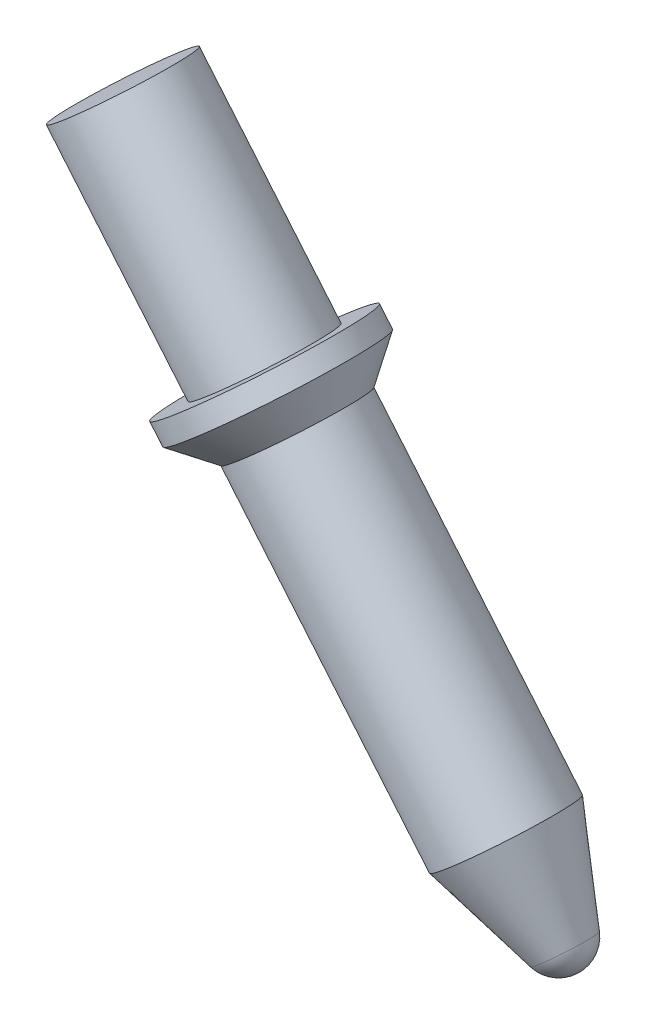
ISO-10303-21;
HEADER;
FILE_DESCRIPTION(('STEP AP214'),'2;1');
FILE_NAME('part.step','',(''),(''),'','','');
FILE_SCHEMA(('AUTOMOTIVE_DESIGN { 1 0 10303 214 1 1 1 1 }'));
ENDSEC;
DATA;
#1=APPLICATION_CONTEXT('core data for automotive mechanical design processes');
#2=APPLICATION_PROTOCOL_DEFINITION('international standard','automotive_design',2000,#1);
#3=PRODUCT_CONTEXT('',#1,'mechanical');
#4=PRODUCT('Part','Part','',(#3));
#5=PRODUCT_RELATED_PRODUCT_CATEGORY('part','',(#4));
#6=PRODUCT_DEFINITION_FORMATION('','',#4);
#7=PRODUCT_DEFINITION_CONTEXT('part definition',#1,'design');
#8=PRODUCT_DEFINITION('design','',#6,#7);
#9=PRODUCT_DEFINITION_SHAPE('','',#8);
#10=(LENGTH_UNIT() NAMED_UNIT(*) SI_UNIT(.MILLI.,.METRE.));
#11=(NAMED_UNIT(*) PLANE_ANGLE_UNIT() SI_UNIT($,.RADIAN.));
#12=(NAMED_UNIT(*) SI_UNIT($,.STERADIAN.) SOLID_ANGLE_UNIT());
#13=UNCERTAINTY_MEASURE_WITH_UNIT(LENGTH_MEASURE(1.E-05),#10,'distance_accuracy_value','');
#14=(GEOMETRIC_REPRESENTATION_CONTEXT(3) GLOBAL_UNCERTAINTY_ASSIGNED_CONTEXT((#13)) GLOBAL_UNIT_ASSIGNED_CONTEXT((#10,
#11,#12)) REPRESENTATION_CONTEXT('',''));
#15=CARTESIAN_POINT('',(0.,0.,0.));
#16=DIRECTION('',(0.,0.,1.));
#17=DIRECTION('',(1.,0.,0.));
#18=AXIS2_PLACEMENT_3D('',#15,#16,#17);
#19=CARTESIAN_POINT('',(21.3994129228267,23.8914042726324,0.));
#20=DIRECTION('',(-0.642787609686539,0.766044443118978,0.));
#21=DIRECTION('',(-0.766044443118978,-0.642787609686539,0.));
#22=AXIS2_PLACEMENT_3D('',#19,#20,#21);
#23=PLANE('',#22);
#24=CARTESIAN_POINT('',(21.3994129228268,23.8914042726325,0.));
#25=DIRECTION('',(0.642787609686539,-0.766044443118978,0.));
#26=DIRECTION('',(0.766044443118978,0.642787609686539,0.));
#27=AXIS2_PLACEMENT_3D('',#24,#25,#26);
#28=CIRCLE('',#27,4.76249999999984);
#29=CARTESIAN_POINT('',(25.0476995831808,26.9526802637646,0.));
#30=VERTEX_POINT('',#29);
#31=EDGE_CURVE('E10',#30,#30,#28,.T.);
#32=ORIENTED_EDGE('',*,*,#31,.F.);
#33=EDGE_LOOP('',(#32));
#34=FACE_BOUND('',#33,.T.);
#35=ADVANCED_FACE('F32',(#34),#23,.T.);
#36=CARTESIAN_POINT('',(56.9918484463898,-18.5260086317515,0.));
#37=DIRECTION('',(0.642787609686539,-0.766044443118978,0.));
#38=DIRECTION('',(0.766044443118978,0.642787609686539,0.));
#39=AXIS2_PLACEMENT_3D('',#36,#37,#38);
#40=CYLINDRICAL_SURFACE('',#39,4.76249999999987);
#41=CARTESIAN_POINT('',(32.5016405173327,10.6602846510815,0.));
#42=DIRECTION('',(0.642787609686539,-0.766044443118978,0.));
#43=DIRECTION('',(0.766044443118978,0.642787609686539,0.));
#44=AXIS2_PLACEMENT_3D('',#41,#42,#43);
#45=CIRCLE('',#44,4.76249999999989);
#46=CARTESIAN_POINT('',(36.1499271776867,13.7215606422136,0.));
#47=VERTEX_POINT('',#46);
#48=EDGE_CURVE('E38',#47,#47,#45,.T.);
#49=CARTESIAN_POINT('',(25.0476995831808,26.9526802637646,0.));
#50=CARTESIAN_POINT('',(25.1633477872903,26.8148561010401,0.));
#51=CARTESIAN_POINT('',(25.2789959913997,26.6770319383156,0.));
#52=CARTESIAN_POINT('',(25.5102923996186,26.4013836128666,0.));
#53=CARTESIAN_POINT('',(25.625940603728,26.2635594501421,0.));
#54=CARTESIAN_POINT('',(25.8572370119469,25.9879111246932,0.));
#55=CARTESIAN_POINT('',(25.9728852160563,25.8500869619687,0.));
#56=CARTESIAN_POINT('',(26.2041816242752,25.5744386365197,0.));
#57=CARTESIAN_POINT('',(26.3198298283846,25.4366144737952,0.));
#58=CARTESIAN_POINT('',(26.5511262366035,25.1609661483462,0.));
#59=CARTESIAN_POINT('',(26.6667744407129,25.0231419856217,0.));
#60=CARTESIAN_POINT('',(26.8980708489318,24.7474936601728,0.));
#61=CARTESIAN_POINT('',(27.0137190530412,24.6096694974483,0.));
#62=CARTESIAN_POINT('',(27.2450154612601,24.3340211719993,0.));
#63=CARTESIAN_POINT('',(27.3606636653696,24.1961970092748,0.));
#64=CARTESIAN_POINT('',(27.5919600735884,23.9205486838258,0.));
#65=CARTESIAN_POINT('',(27.7076082776979,23.7827245211013,0.));
#66=CARTESIAN_POINT('',(27.9389046859167,23.5070761956523,0.));
#67=CARTESIAN_POINT('',(28.0545528900262,23.3692520329279,0.));
#68=CARTESIAN_POINT('',(28.285849298245,23.0936037074789,0.));
#69=CARTESIAN_POINT('',(28.4014975023545,22.9557795447544,0.));
#70=CARTESIAN_POINT('',(28.6327939105734,22.6801312193054,0.));
#71=CARTESIAN_POINT('',(28.7484421146828,22.5423070565809,0.));
#72=CARTESIAN_POINT('',(28.9797385229017,22.2666587311319,0.));
#73=CARTESIAN_POINT('',(29.0953867270111,22.1288345684075,0.));
#74=CARTESIAN_POINT('',(29.32668313523,21.8531862429585,0.));
#75=CARTESIAN_POINT('',(29.4423313393394,21.715362080234,0.));
#76=CARTESIAN_POINT('',(29.6736277475583,21.439713754785,0.));
#77=CARTESIAN_POINT('',(29.7892759516677,21.3018895920605,0.));
#78=CARTESIAN_POINT('',(30.0205723598866,21.0262412666115,0.));
#79=CARTESIAN_POINT('',(30.136220563996,20.8884171038871,0.));
#80=CARTESIAN_POINT('',(30.3675169722149,20.6127687784381,0.));
#81=CARTESIAN_POINT('',(30.4831651763243,20.4749446157136,0.));
#82=CARTESIAN_POINT('',(30.7144615845432,20.1992962902646,0.));
#83=CARTESIAN_POINT('',(30.8301097886526,20.0614721275401,0.));
#84=CARTESIAN_POINT('',(31.0614061968715,19.7858238020911,0.));
#85=CARTESIAN_POINT('',(31.177054400981,19.6479996393666,0.));
#86=CARTESIAN_POINT('',(31.4083508091998,19.3723513139177,0.));
#87=CARTESIAN_POINT('',(31.5239990133093,19.2345271511932,0.));
#88=CARTESIAN_POINT('',(31.7552954215281,18.9588788257442,0.));
#89=CARTESIAN_POINT('',(31.8709436256376,18.8210546630197,0.));
#90=CARTESIAN_POINT('',(32.1022400338564,18.5454063375707,0.));
#91=CARTESIAN_POINT('',(32.2178882379659,18.4075821748462,0.));
#92=CARTESIAN_POINT('',(32.4491846461848,18.1319338493973,0.));
#93=CARTESIAN_POINT('',(32.5648328502942,17.9941096866728,0.));
#94=CARTESIAN_POINT('',(32.7961292585131,17.7184613612238,0.));
#95=CARTESIAN_POINT('',(32.9117774626225,17.5806371984993,0.));
#96=CARTESIAN_POINT('',(33.1430738708414,17.3049888730503,0.));
#97=CARTESIAN_POINT('',(33.2587220749508,17.1671647103258,0.));
#98=CARTESIAN_POINT('',(33.4900184831697,16.8915163848769,0.));
#99=CARTESIAN_POINT('',(33.6056666872791,16.7536922221524,0.));
#100=CARTESIAN_POINT('',(33.836963095498,16.4780438967034,0.));
#101=CARTESIAN_POINT('',(33.9526112996074,16.3402197339789,0.));
#102=CARTESIAN_POINT('',(34.1839077078263,16.0645714085299,0.));
#103=CARTESIAN_POINT('',(34.2995559119357,15.9267472458054,0.));
#104=CARTESIAN_POINT('',(34.5308523201546,15.6510989203565,0.));
#105=CARTESIAN_POINT('',(34.646500524264,15.513274757632,0.));
#106=CARTESIAN_POINT('',(34.8777969324829,15.237626432183,0.));
#107=CARTESIAN_POINT('',(34.9934451365924,15.0998022694585,0.));
#108=CARTESIAN_POINT('',(35.2247415448112,14.8241539440095,0.));
#109=CARTESIAN_POINT('',(35.3403897489207,14.686329781285,0.));
#110=CARTESIAN_POINT('',(35.5716861571395,14.410681455836,0.));
#111=CARTESIAN_POINT('',(35.687334361249,14.2728572931116,0.));
#112=CARTESIAN_POINT('',(35.9186307694678,13.9972089676626,0.));
#113=CARTESIAN_POINT('',(36.0342789735773,13.8593848049381,0.));
#114=CARTESIAN_POINT('',(36.1499271776867,13.7215606422136,0.));
#115=B_SPLINE_CURVE_WITH_KNOTS('',3,(#49,#50,#51,#52,#53,#54,#55,#56,#57,#58,#59,#60,#61,#62,
#63,#64,#65,#66,#67,#68,#69,#70,#71,#72,#73,#74,#75,#76,#77,#78,#79,#80,#81,#82,#83,#84,#85,#86,
#87,#88,#89,#90,#91,#92,#93,#94,#95,#96,#97,#98,#99,#100,#101,#102,#103,#104,#105,#106,#107,
#108,#109,#110,#111,#112,#113,#114),.UNSPECIFIED.,.F.,.F.,(4,2,2,2,2,2,2,2,2,2,2,2,2,2,2,2,2,2,
2,2,2,2,2,2,2,2,2,2,2,2,2,2,4),(0.,0.539750000000002,1.0795,1.61925,2.159,2.69875,3.2385,
3.77824999999999,4.31800000000001,4.85775,5.3975,5.93725,6.477,7.01675,7.5565,8.09625,8.636,
9.17574999999999,9.7155,10.25525,10.795,11.33475,11.8745,12.41425,12.954,13.49375,14.0335,
14.57325,15.113,15.65275,16.1925,16.73225,17.272),.UNSPECIFIED.);
#116=EDGE_CURVE('BSEAM77',#30,#47,#115,.T.);
#117=ORIENTED_EDGE('',*,*,#31,.T.);
#118=ORIENTED_EDGE('',*,*,#48,.F.);
#119=ORIENTED_EDGE('',*,*,#116,.T.);
#120=ORIENTED_EDGE('',*,*,#116,.F.);
#121=EDGE_LOOP('',(#117,#119,#118,#120));
#122=FACE_BOUND('',#121,.T.);
#123=ADVANCED_FACE('F77',(#122),#40,.T.);
#124=CARTESIAN_POINT('',(36.1499271776867,13.7215606422136,0.));
#125=DIRECTION('',(-0.642787609686539,0.766044443118978,0.));
#126=DIRECTION('',(-0.766044443118978,-0.642787609686539,0.));
#127=AXIS2_PLACEMENT_3D('',#124,#125,#126);
#128=PLANE('',#127);
#129=ORIENTED_EDGE('',*,*,#48,.T.);
#130=EDGE_LOOP('',(#129));
#131=FACE_BOUND('',#130,.T.);
#132=CARTESIAN_POINT('',(32.5016405173327,10.6602846510815,0.));
#133=DIRECTION('',(0.642787609686539,-0.766044443118978,0.));
#134=DIRECTION('',(0.766044443118978,0.642787609686539,0.));
#135=AXIS2_PLACEMENT_3D('',#132,#133,#134);
#136=CIRCLE('',#135,7.1500999999999);
#137=CARTESIAN_POINT('',(37.9789348900776,15.2562803391012,0.));
#138=VERTEX_POINT('',#137);
#139=EDGE_CURVE('E42',#138,#138,#136,.T.);
#140=ORIENTED_EDGE('',*,*,#139,.F.);
#141=EDGE_LOOP('',(#140));
#142=FACE_BOUND('',#141,.T.);
#143=ADVANCED_FACE('F82',(#131,#142),#128,.T.);
#144=CARTESIAN_POINT('',(56.9918484463898,-18.5260086317515,0.));
#145=DIRECTION('',(0.642787609686539,-0.766044443118978,0.));
#146=DIRECTION('',(0.766044443118978,0.642787609686539,0.));
#147=AXIS2_PLACEMENT_3D('',#144,#145,#146);
#148=CYLINDRICAL_SURFACE('',#147,7.1500999999999);
#149=CARTESIAN_POINT('',(33.5302292503531,9.43446033320256,0.));
#150=DIRECTION('',(0.642787609686539,-0.766044443118978,0.));
#151=DIRECTION('',(0.766044443118978,0.642787609686539,0.));
#152=AXIS2_PLACEMENT_3D('',#149,#150,#151);
#153=CIRCLE('',#152,7.1500999999999);
#154=CARTESIAN_POINT('',(39.007523623098,14.0304560212222,0.));
#155=VERTEX_POINT('',#154);
#156=EDGE_CURVE('E46',#155,#155,#153,.T.);
#157=CARTESIAN_POINT('',(37.9789348900776,15.2562803391012,0.));
#158=CARTESIAN_POINT('',(37.9896493560466,15.24351133579,0.));
#159=CARTESIAN_POINT('',(38.0003638220155,15.2307423324787,0.));
#160=CARTESIAN_POINT('',(38.0217927539535,15.2052043258563,0.));
#161=CARTESIAN_POINT('',(38.0325072199224,15.192435322545,0.));
#162=CARTESIAN_POINT('',(38.0539361518604,15.1668973159225,0.));
#163=CARTESIAN_POINT('',(38.0646506178293,15.1541283126113,0.));
#164=CARTESIAN_POINT('',(38.0860795497672,15.1285903059888,0.));
#165=CARTESIAN_POINT('',(38.0967940157362,15.1158213026776,0.));
#166=CARTESIAN_POINT('',(38.1182229476741,15.0902832960551,0.));
#167=CARTESIAN_POINT('',(38.1289374136431,15.0775142927439,0.));
#168=CARTESIAN_POINT('',(38.150366345581,15.0519762861214,0.));
#169=CARTESIAN_POINT('',(38.16108081155,15.0392072828101,0.));
#170=CARTESIAN_POINT('',(38.1825097434879,15.0136692761877,0.));
#171=CARTESIAN_POINT('',(38.1932242094569,15.0009002728764,0.));
#172=CARTESIAN_POINT('',(38.2146531413948,14.9753622662539,0.));
#173=CARTESIAN_POINT('',(38.2253676073638,14.9625932629427,0.));
#174=CARTESIAN_POINT('',(38.2467965393017,14.9370552563202,0.));
#175=CARTESIAN_POINT('',(38.2575110052706,14.924286253009,0.));
#176=CARTESIAN_POINT('',(38.2789399372086,14.8987482463865,0.));
#177=CARTESIAN_POINT('',(38.2896544031775,14.8859792430753,0.));
#178=CARTESIAN_POINT('',(38.3110833351155,14.8604412364528,0.));
#179=CARTESIAN_POINT('',(38.3217978010844,14.8476722331415,0.));
#180=CARTESIAN_POINT('',(38.3432267330223,14.8221342265191,0.));
#181=CARTESIAN_POINT('',(38.3539411989913,14.8093652232078,0.));
#182=CARTESIAN_POINT('',(38.3753701309292,14.7838272165853,0.));
#183=CARTESIAN_POINT('',(38.3860845968982,14.7710582132741,0.));
#184=CARTESIAN_POINT('',(38.4075135288361,14.7455202066516,0.));
#185=CARTESIAN_POINT('',(38.4182279948051,14.7327512033404,0.));
#186=CARTESIAN_POINT('',(38.439656926743,14.7072131967179,0.));
#187=CARTESIAN_POINT('',(38.450371392712,14.6944441934067,0.));
#188=CARTESIAN_POINT('',(38.4718003246499,14.6689061867842,0.));
#189=CARTESIAN_POINT('',(38.4825147906189,14.656137183473,0.));
#190=CARTESIAN_POINT('',(38.5039437225568,14.6305991768505,0.));
#191=CARTESIAN_POINT('',(38.5146581885258,14.6178301735392,0.));
#192=CARTESIAN_POINT('',(38.5360871204637,14.5922921669168,0.));
#193=CARTESIAN_POINT('',(38.5468015864326,14.5795231636055,0.));
#194=CARTESIAN_POINT('',(38.5682305183706,14.553985156983,0.));
#195=CARTESIAN_POINT('',(38.5789449843395,14.5412161536718,0.));
#196=CARTESIAN_POINT('',(38.6003739162774,14.5156781470493,0.));
#197=CARTESIAN_POINT('',(38.6110883822464,14.5029091437381,0.));
#198=CARTESIAN_POINT('',(38.6325173141843,14.4773711371156,0.));
#199=CARTESIAN_POINT('',(38.6432317801533,14.4646021338044,0.));
#200=CARTESIAN_POINT('',(38.6646607120912,14.4390641271819,0.));
#201=CARTESIAN_POINT('',(38.6753751780602,14.4262951238706,0.));
#202=CARTESIAN_POINT('',(38.6968041099981,14.4007571172482,0.));
#203=CARTESIAN_POINT('',(38.7075185759671,14.3879881139369,0.));
#204=CARTESIAN_POINT('',(38.728947507905,14.3624501073144,0.));
#205=CARTESIAN_POINT('',(38.739661973874,14.3496811040032,0.));
#206=CARTESIAN_POINT('',(38.7610909058119,14.3241430973807,0.));
#207=CARTESIAN_POINT('',(38.7718053717809,14.3113740940695,0.));
#208=CARTESIAN_POINT('',(38.7932343037188,14.285836087447,0.));
#209=CARTESIAN_POINT('',(38.8039487696877,14.2730670841358,0.));
#210=CARTESIAN_POINT('',(38.8253777016257,14.2475290775133,0.));
#211=CARTESIAN_POINT('',(38.8360921675946,14.2347600742021,0.));
#212=CARTESIAN_POINT('',(38.8575210995325,14.2092220675796,0.));
#213=CARTESIAN_POINT('',(38.8682355655015,14.1964530642683,0.));
#214=CARTESIAN_POINT('',(38.8896644974394,14.1709150576459,0.));
#215=CARTESIAN_POINT('',(38.9003789634084,14.1581460543346,0.));
#216=CARTESIAN_POINT('',(38.9218078953463,14.1326080477121,0.));
#217=CARTESIAN_POINT('',(38.9325223613153,14.1198390444009,0.));
#218=CARTESIAN_POINT('',(38.9539512932532,14.0943010377784,0.));
#219=CARTESIAN_POINT('',(38.9646657592222,14.0815320344672,0.));
#220=CARTESIAN_POINT('',(38.9860946911601,14.0559940278447,0.));
#221=CARTESIAN_POINT('',(38.9968091571291,14.0432250245335,0.));
#222=CARTESIAN_POINT('',(39.007523623098,14.0304560212222,0.));
#223=B_SPLINE_CURVE_WITH_KNOTS('',3,(#157,#158,#159,#160,#161,#162,#163,#164,#165,#166,#167,
#168,#169,#170,#171,#172,#173,#174,#175,#176,#177,#178,#179,#180,#181,#182,#183,#184,#185,#186,
#187,#188,#189,#190,#191,#192,#193,#194,#195,#196,#197,#198,#199,#200,#201,#202,#203,#204,#205,
#206,#207,#208,#209,#210,#211,#212,#213,#214,#215,#216,#217,#218,#219,#220,#221,#222),
.UNSPECIFIED.,.F.,.F.,(4,2,2,2,2,2,2,2,2,2,2,2,2,2,2,2,2,2,2,2,2,2,2,2,2,2,2,2,2,2,2,2,4),(0.,
0.0500062499999992,0.100012500000006,0.150018750000005,0.200025000000001,0.250031250000008,
0.300037500000007,0.350043750000006,0.400050000000003,0.450056250000005,0.500062500000004,
0.550068750000003,0.600075000000005,0.650081250000002,0.700087500000001,0.750093750000012,
0.800100000000011,0.850106250000008,0.90011250000001,0.950118750000009,1.00012500000001,
1.05013125000001,1.10013750000001,1.15014375000001,1.20015000000001,1.25015625000001,
1.30016250000001,1.35016875000001,1.40017500000001,1.45018125000001,1.50018750000001,
1.55019375000001,1.60020000000001),.UNSPECIFIED.);
#224=EDGE_CURVE('BSEAM86',#138,#155,#223,.T.);
#225=ORIENTED_EDGE('',*,*,#139,.T.);
#226=ORIENTED_EDGE('',*,*,#156,.F.);
#227=ORIENTED_EDGE('',*,*,#224,.T.);
#228=ORIENTED_EDGE('',*,*,#224,.F.);
#229=EDGE_LOOP('',(#225,#227,#226,#228));
#230=FACE_BOUND('',#229,.T.);
#231=ADVANCED_FACE('F86',(#230),#148,.T.);
#232=CARTESIAN_POINT('',(35.0649489472407,7.60545262081169,0.));
#233=DIRECTION('',(-0.642787609686539,0.766044443118978,0.));
#234=DIRECTION('',(-0.766044443118978,-0.642787609686539,0.));
#235=AXIS2_PLACEMENT_3D('',#232,#233,#234);
#236=CONICAL_SURFACE('',#235,4.7624999999999,0.785398163397449);
#237=ORIENTED_EDGE('',*,*,#156,.T.);
#238=EDGE_LOOP('',(#237));
#239=FACE_BOUND('',#238,.T.);
#240=CARTESIAN_POINT('',(35.0649489472407,7.60545262081169,0.));
#241=DIRECTION('',(0.642787609686539,-0.766044443118978,0.));
#242=DIRECTION('',(0.766044443118978,0.642787609686539,0.));
#243=AXIS2_PLACEMENT_3D('',#240,#241,#242);
#244=CIRCLE('',#243,4.76249999999991);
#245=CARTESIAN_POINT('',(38.7132356075948,10.6667286119438,0.));
#246=VERTEX_POINT('',#245);
#247=EDGE_CURVE('E51',#246,#246,#244,.T.);
#248=ORIENTED_EDGE('',*,*,#247,.F.);
#249=EDGE_LOOP('',(#248));
#250=FACE_BOUND('',#249,.T.);
#251=ADVANCED_FACE('F73',(#239,#250),#236,.T.);
#252=CARTESIAN_POINT('',(56.9918484463898,-18.5260086317515,0.));
#253=DIRECTION('',(0.642787609686539,-0.766044443118978,0.));
#254=DIRECTION('',(0.766044443118978,0.642787609686539,0.));
#255=AXIS2_PLACEMENT_3D('',#252,#253,#254);
#256=CYLINDRICAL_SURFACE('',#255,4.76249999999994);
#257=CARTESIAN_POINT('',(51.4110113645312,-11.8750259897635,0.));
#258=DIRECTION('',(0.642787609686539,-0.766044443118978,0.));
#259=DIRECTION('',(0.766044443118978,0.642787609686539,0.));
#260=AXIS2_PLACEMENT_3D('',#257,#258,#259);
#261=CIRCLE('',#260,4.76249999999998);
#262=CARTESIAN_POINT('',(55.0592980248853,-8.81374999863144,0.));
#263=VERTEX_POINT('',#262);
#264=EDGE_CURVE('E54',#263,#263,#261,.T.);
#265=CARTESIAN_POINT('',(38.7132356075948,10.6667286119438,0.));
#266=CARTESIAN_POINT('',(38.8835070911082,10.4638069597503,0.));
#267=CARTESIAN_POINT('',(39.0537785746216,10.2608853075568,0.));
#268=CARTESIAN_POINT('',(39.3943215416485,9.85504200316983,0.));
#269=CARTESIAN_POINT('',(39.564593025162,9.65212035097634,0.));
#270=CARTESIAN_POINT('',(39.9051359921889,9.24627704658936,0.));
#271=CARTESIAN_POINT('',(40.0754074757023,9.04335539439586,0.));
#272=CARTESIAN_POINT('',(40.4159504427292,8.63751209000888,0.));
#273=CARTESIAN_POINT('',(40.5862219262426,8.43459043781539,0.));
#274=CARTESIAN_POINT('',(40.9267648932695,8.02874713342841,0.));
#275=CARTESIAN_POINT('',(41.097036376783,7.82582548123491,0.));
#276=CARTESIAN_POINT('',(41.4375793438099,7.41998217684793,0.));
#277=CARTESIAN_POINT('',(41.6078508273233,7.21706052465443,0.));
#278=CARTESIAN_POINT('',(41.9483937943502,6.81121722026745,0.));
#279=CARTESIAN_POINT('',(42.1186652778636,6.60829556807396,0.));
#280=CARTESIAN_POINT('',(42.4592082448905,6.20245226368698,0.));
#281=CARTESIAN_POINT('',(42.629479728404,5.99953061149348,0.));
#282=CARTESIAN_POINT('',(42.9700226954308,5.5936873071065,0.));
#283=CARTESIAN_POINT('',(43.1402941789443,5.39076565491301,0.));
#284=CARTESIAN_POINT('',(43.4808371459712,4.98492235052602,0.));
#285=CARTESIAN_POINT('',(43.6511086294846,4.78200069833253,0.));
#286=CARTESIAN_POINT('',(43.9916515965115,4.37615739394555,0.));
#287=CARTESIAN_POINT('',(44.1619230800249,4.17323574175205,0.));
#288=CARTESIAN_POINT('',(44.5024660470518,3.76739243736507,0.));
#289=CARTESIAN_POINT('',(44.6727375305653,3.56447078517157,0.));
#290=CARTESIAN_POINT('',(45.0132804975922,3.15862748078459,0.));
#291=CARTESIAN_POINT('',(45.1835519811056,2.9557058285911,0.));
#292=CARTESIAN_POINT('',(45.5240949481325,2.54986252420412,0.));
#293=CARTESIAN_POINT('',(45.6943664316459,2.34694087201063,0.));
#294=CARTESIAN_POINT('',(46.0349093986728,1.94109756762364,0.));
#295=CARTESIAN_POINT('',(46.2051808821863,1.73817591543015,0.));
#296=CARTESIAN_POINT('',(46.5457238492132,1.33233261104317,0.));
#297=CARTESIAN_POINT('',(46.7159953327266,1.12941095884967,0.));
#298=CARTESIAN_POINT('',(47.0565382997535,0.723567654462689,0.));
#299=CARTESIAN_POINT('',(47.2268097832669,0.520646002269195,0.));
#300=CARTESIAN_POINT('',(47.5673527502938,0.114802697882212,0.));
#301=CARTESIAN_POINT('',(47.7376242338073,-0.0881189543112791,0.));
#302=CARTESIAN_POINT('',(48.0781672008341,-0.493962258698262,0.));
#303=CARTESIAN_POINT('',(48.2484386843476,-0.696883910891755,0.));
#304=CARTESIAN_POINT('',(48.5889816513745,-1.10272721527874,0.));
#305=CARTESIAN_POINT('',(48.7592531348879,-1.30564886747223,0.));
#306=CARTESIAN_POINT('',(49.0997961019148,-1.71149217185922,0.));
#307=CARTESIAN_POINT('',(49.2700675854283,-1.91441382405271,0.));
#308=CARTESIAN_POINT('',(49.6106105524551,-2.32025712843969,0.));
#309=CARTESIAN_POINT('',(49.7808820359686,-2.52317878063318,0.));
#310=CARTESIAN_POINT('',(50.1214250029955,-2.92902208502017,0.));
#311=CARTESIAN_POINT('',(50.2916964865089,-3.13194373721366,0.));
#312=CARTESIAN_POINT('',(50.6322394535358,-3.53778704160064,0.));
#313=CARTESIAN_POINT('',(50.8025109370492,-3.74070869379414,0.));
#314=CARTESIAN_POINT('',(51.1430539040761,-4.14655199818112,0.));
#315=CARTESIAN_POINT('',(51.3133253875896,-4.34947365037461,0.));
#316=CARTESIAN_POINT('',(51.6538683546165,-4.7553169547616,0.));
#317=CARTESIAN_POINT('',(51.8241398381299,-4.95823860695509,0.));
#318=CARTESIAN_POINT('',(52.1646828051568,-5.36408191134207,0.));
#319=CARTESIAN_POINT('',(52.3349542886702,-5.56700356353557,0.));
#320=CARTESIAN_POINT('',(52.6754972556971,-5.97284686792255,0.));
#321=CARTESIAN_POINT('',(52.8457687392106,-6.17576852011604,0.));
#322=CARTESIAN_POINT('',(53.1863117062374,-6.58161182450303,0.));
#323=CARTESIAN_POINT('',(53.3565831897509,-6.78453347669652,0.));
#324=CARTESIAN_POINT('',(53.6971261567778,-7.1903767810835,0.));
#325=CARTESIAN_POINT('',(53.8673976402912,-7.39329843327699,0.));
#326=CARTESIAN_POINT('',(54.2079406073181,-7.79914173766398,0.));
#327=CARTESIAN_POINT('',(54.3782120908316,-8.00206338985747,0.));
#328=CARTESIAN_POINT('',(54.7187550578584,-8.40790669424445,0.));
#329=CARTESIAN_POINT('',(54.8890265413719,-8.61082834643795,0.));
#330=CARTESIAN_POINT('',(55.0592980248853,-8.81374999863144,0.));
#331=B_SPLINE_CURVE_WITH_KNOTS('',3,(#265,#266,#267,#268,#269,#270,#271,#272,#273,#274,#275,
#276,#277,#278,#279,#280,#281,#282,#283,#284,#285,#286,#287,#288,#289,#290,#291,#292,#293,#294,
#295,#296,#297,#298,#299,#300,#301,#302,#303,#304,#305,#306,#307,#308,#309,#310,#311,#312,#313,
#314,#315,#316,#317,#318,#319,#320,#321,#322,#323,#324,#325,#326,#327,#328,#329,#330),
.UNSPECIFIED.,.F.,.F.,(4,2,2,2,2,2,2,2,2,2,2,2,2,2,2,2,2,2,2,2,2,2,2,2,2,2,2,2,2,2,2,2,4),(0.,
0.794686211810207,1.5893724236204,2.3840586354306,3.17874484724081,3.97343105905101,
4.76811727086121,5.56280348267141,6.35748969448161,7.15217590629182,7.94686211810202,
8.74154832991222,9.53623454172243,10.3309207535326,11.1256069653428,11.920293177153,
12.7149793889632,13.5096656007734,14.3043518125836,15.0990380243938,15.893724236204,
16.6884104480142,17.4830966598244,18.2777828716346,19.0724690834448,19.867155295255,
20.6618415070652,21.4565277188754,22.2512139306856,23.0459001424958,23.8405863543061,
24.6352725661163,25.4299587779265),.UNSPECIFIED.);
#332=EDGE_CURVE('BSEAM65',#246,#263,#331,.T.);
#333=ORIENTED_EDGE('',*,*,#247,.T.);
#334=ORIENTED_EDGE('',*,*,#264,.F.);
#335=ORIENTED_EDGE('',*,*,#332,.T.);
#336=ORIENTED_EDGE('',*,*,#332,.F.);
#337=EDGE_LOOP('',(#333,#335,#334,#336));
#338=FACE_BOUND('',#337,.T.);
#339=ADVANCED_FACE('F65',(#338),#256,.T.);
#340=CARTESIAN_POINT('',(56.0239486859484,-17.3725106149744,0.));
#341=DIRECTION('',(-0.642787609686539,0.766044443118978,0.));
#342=DIRECTION('',(-0.766044443118978,-0.642787609686539,0.));
#343=AXIS2_PLACEMENT_3D('',#340,#341,#342);
#344=CONICAL_SURFACE('',#343,2.15048344549566,0.349065850398865);
#345=ORIENTED_EDGE('',*,*,#264,.T.);
#346=EDGE_LOOP('',(#345));
#347=FACE_BOUND('',#346,.T.);
#348=CARTESIAN_POINT('',(56.0239486859484,-17.3725106149744,0.));
#349=DIRECTION('',(0.642787609686539,-0.766044443118978,0.));
#350=DIRECTION('',(0.766044443118978,0.642787609686539,0.));
#351=AXIS2_PLACEMENT_3D('',#348,#349,#350);
#352=CIRCLE('',#351,2.15048344549566);
#353=CARTESIAN_POINT('',(57.6713145793897,-15.9902065013737,0.));
#354=VERTEX_POINT('',#353);
#355=EDGE_CURVE('E57',#354,#354,#352,.T.);
#356=ORIENTED_EDGE('',*,*,#355,.F.);
#357=EDGE_LOOP('',(#356));
#358=FACE_BOUND('',#357,.T.);
#359=ADVANCED_FACE('F63',(#347,#358),#344,.T.);
#360=CARTESIAN_POINT('',(55.520831133894,-16.7729184648164,0.));
#361=DIRECTION('',(0.642787609686539,-0.766044443118978,0.));
#362=DIRECTION('',(0.766044443118978,0.642787609686539,0.));
#363=AXIS2_PLACEMENT_3D('',#360,#361,#362);
#364=SPHERICAL_SURFACE('',#363,2.28849668277389);
#365=ORIENTED_EDGE('',*,*,#355,.T.);
#366=EDGE_LOOP('',(#365));
#367=FACE_BOUND('',#366,.T.);
#368=ADVANCED_FACE('F61',(#367),#364,.T.);
#369=CLOSED_SHELL('',(#35,#123,#143,#231,#251,#339,#359,#368));
#370=MANIFOLD_SOLID_BREP('B2',#369);
#371=ADVANCED_BREP_SHAPE_REPRESENTATION('',(#18,#370),#14);
#372=SHAPE_DEFINITION_REPRESENTATION(#9,#371);
ENDSEC;
END-ISO-10303-21;
